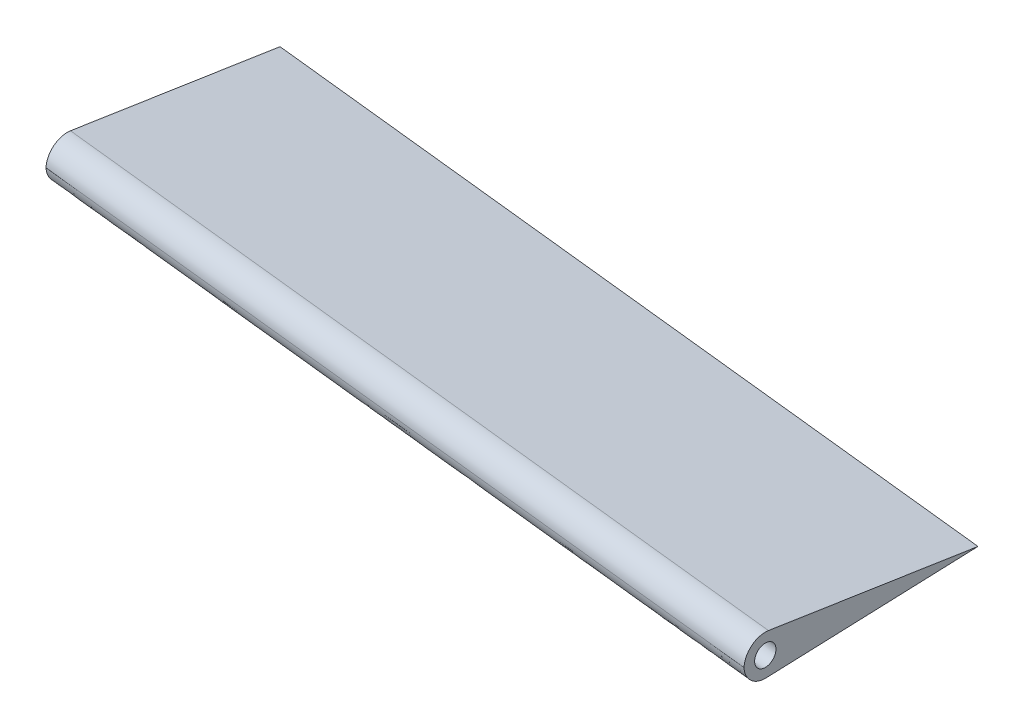
ISO-10303-21;
HEADER;
FILE_DESCRIPTION(('STEP AP214'),'2;1');
FILE_NAME('part.step','',(''),(''),'','','');
FILE_SCHEMA(('AUTOMOTIVE_DESIGN { 1 0 10303 214 1 1 1 1 }'));
ENDSEC;
DATA;
#1=APPLICATION_CONTEXT('core data for automotive mechanical design processes');
#2=APPLICATION_PROTOCOL_DEFINITION('international standard','automotive_design',2000,#1);
#3=PRODUCT_CONTEXT('',#1,'mechanical');
#4=PRODUCT('Part','Part','',(#3));
#5=PRODUCT_RELATED_PRODUCT_CATEGORY('part','',(#4));
#6=PRODUCT_DEFINITION_FORMATION('','',#4);
#7=PRODUCT_DEFINITION_CONTEXT('part definition',#1,'design');
#8=PRODUCT_DEFINITION('design','',#6,#7);
#9=PRODUCT_DEFINITION_SHAPE('','',#8);
#10=(LENGTH_UNIT() NAMED_UNIT(*) SI_UNIT(.MILLI.,.METRE.));
#11=(NAMED_UNIT(*) PLANE_ANGLE_UNIT() SI_UNIT($,.RADIAN.));
#12=(NAMED_UNIT(*) SI_UNIT($,.STERADIAN.) SOLID_ANGLE_UNIT());
#13=UNCERTAINTY_MEASURE_WITH_UNIT(LENGTH_MEASURE(1.E-05),#10,'distance_accuracy_value','');
#14=(GEOMETRIC_REPRESENTATION_CONTEXT(3) GLOBAL_UNCERTAINTY_ASSIGNED_CONTEXT((#13)) GLOBAL_UNIT_ASSIGNED_CONTEXT((#10,
#11,#12)) REPRESENTATION_CONTEXT('',''));
#15=CARTESIAN_POINT('',(0.,0.,0.));
#16=DIRECTION('',(0.,0.,1.));
#17=DIRECTION('',(1.,0.,0.));
#18=AXIS2_PLACEMENT_3D('',#15,#16,#17);
#19=CARTESIAN_POINT('',(0.,0.,0.));
#20=DIRECTION('',(1.,0.,0.));
#21=DIRECTION('',(0.,0.,-1.));
#22=AXIS2_PLACEMENT_3D('',#19,#20,#21);
#23=PLANE('',#22);
#24=CARTESIAN_POINT('',(0.,-0.3146960033909,22.5890369420885));
#25=DIRECTION('',(1.,0.,0.));
#26=DIRECTION('',(0.,0.,1.));
#27=AXIS2_PLACEMENT_3D('',#24,#25,#26);
#28=ELLIPSE('',#27,2.51432968015768,2.5);
#29=CARTESIAN_POINT('',(0.,-0.3146960033909,25.1033666222462));
#30=VERTEX_POINT('',#29);
#31=EDGE_CURVE('E136',#30,#30,#28,.T.);
#32=ORIENTED_EDGE('',*,*,#31,.T.);
#33=EDGE_LOOP('',(#32));
#34=FACE_BOUND('',#33,.T.);
#35=DIRECTION('',(0.,0.0373019729604991,-0.999304039225928));
#36=VECTOR('',#35,1.);
#37=CARTESIAN_POINT('',(0.,-3.17592912009792,-27.625));
#38=LINE('',#37,#36);
#39=CARTESIAN_POINT('',(0.,-5.04354721919535,22.4076969872574));
#40=VERTEX_POINT('',#39);
#41=CARTESIAN_POINT('',(0.,-3.17592912009792,-27.625));
#42=VERTEX_POINT('',#41);
#43=EDGE_CURVE('E123',#40,#42,#38,.T.);
#44=ORIENTED_EDGE('',*,*,#43,.F.);
#45=CARTESIAN_POINT('',(202.232306720039,-0.0504525145305452,49.3087912444578));
#46=CARTESIAN_POINT('',(202.232221022979,-5.24202816377805,49.3087820558312));
#47=CARTESIAN_POINT('',(202.78531289137,-5.04692032005726,44.1504412330736));
#48=CARTESIAN_POINT('',(196.160536840523,-0.0503511357956261,48.6577627679144));
#49=CARTESIAN_POINT('',(196.160438314185,-5.24191621252106,48.6577522037044));
#50=CARTESIAN_POINT('',(196.71354192783,-5.04681932374674,43.4994228663843));
#51=CARTESIAN_POINT('',(190.088766961008,-0.0502497570607069,48.006734291371));
#52=CARTESIAN_POINT('',(190.08866843484,-5.24180426150062,48.0067237271793));
#53=CARTESIAN_POINT('',(190.64177096429,-5.04671832743621,42.8484044996949));
#54=CARTESIAN_POINT('',(184.016997081492,-0.0501483783257878,47.3557058148276));
#55=CARTESIAN_POINT('',(184.016911384903,-5.24169231071673,47.3556966262514));
#56=CARTESIAN_POINT('',(184.57000000075,-5.04661733112569,42.1973861330055));
#57=CARTESIAN_POINT('',(171.764231462868,-0.0499437973171223,46.0419374256389));
#58=CARTESIAN_POINT('',(171.764171888981,-5.24146639549514,46.041931037996));
#59=CARTESIAN_POINT('',(172.317232194576,-5.04641352154402,40.8836381454083));
#60=CARTESIAN_POINT('',(159.511465844245,-0.0497392161220963,44.7281690364501));
#61=CARTESIAN_POINT('',(159.511406270487,-5.24124047973213,44.7281626488213));
#62=CARTESIAN_POINT('',(160.0644643884,-5.04620971170966,39.569890157823));
#63=CARTESIAN_POINT('',(128.934164727482,-0.0492286746013664,41.4496037815293));
#64=CARTESIAN_POINT('',(128.934137458176,-5.24067669779517,41.4496008576546));
#65=CARTESIAN_POINT('',(129.487157812505,-5.04570109491283,36.2913758160095));
#66=CARTESIAN_POINT('',(110.609629229342,-0.0489227140819818,39.4848069157972));
#67=CARTESIAN_POINT('',(110.609601959887,-5.24033883098845,39.4848039919064));
#68=CARTESIAN_POINT('',(111.162619042782,-5.04539628763793,34.3266094617974));
#69=CARTESIAN_POINT('',(73.9605582330638,-0.0483107925415967,35.5552131843329));
#70=CARTESIAN_POINT('',(73.9605309641831,-5.2396630974396,35.5552102605038));
#71=CARTESIAN_POINT('',(74.5135415033312,-5.04478667195823,30.397076753439));
#72=CARTESIAN_POINT('',(55.6360227349244,-0.0480048315205963,33.5904163186008));
#73=CARTESIAN_POINT('',(55.6359954658938,-5.23932523069746,33.5904133947556));
#74=CARTESIAN_POINT('',(56.189002733602,-5.04448186355343,28.4323103992926));
#75=CARTESIAN_POINT('',(24.6900015031474,-0.0474881315512742,30.2723160846686));
#76=CARTESIAN_POINT('',(24.6899435276472,-5.23875464904923,30.2723098684084));
#77=CARTESIAN_POINT('',(25.24297597684,-5.04396710972218,25.1142616926196));
#78=CARTESIAN_POINT('',(12.0685157695098,-0.0472773927843041,28.9190127164685));
#79=CARTESIAN_POINT('',(12.0684577941321,-5.23852193474188,28.9190065002214));
#80=CARTESIAN_POINT('',(12.6214879898087,-5.04375716459272,23.7609793400775));
#81=CARTESIAN_POINT('',(-0.552969964127832,-0.047066653822848,27.5657093482685));
#82=CARTESIAN_POINT('',(-0.553055655944351,-5.23828921986331,27.565700160204));
#83=CARTESIAN_POINT('',(2.776070567867E-09,-5.04354721919514,22.4076969875481));
#84=CARTESIAN_POINT('',(-6.25601972862951,-0.0469714309814772,26.9542158507364));
#85=CARTESIAN_POINT('',(-6.25611673815051,-5.2381840671987,26.9542054491629));
#86=CARTESIAN_POINT('',(-5.70305077992851,-5.04345235478978,21.7962129860065));
#87=CARTESIAN_POINT('',(-11.9590694931312,-0.0468762081401064,26.3427223532044));
#88=CARTESIAN_POINT('',(-11.9591665024935,-5.23807891474277,26.3427119516479));
#89=CARTESIAN_POINT('',(-11.4061015626331,-5.04335749038441,21.1847289844648));
#90=CARTESIAN_POINT('',(-17.6621192576329,-0.0467809852987356,25.7312288556723));
#91=CARTESIAN_POINT('',(-17.662204949007,-5.23797376249552,25.7312196676554));
#92=CARTESIAN_POINT('',(-17.1091523453377,-5.04326262597904,20.5732449829231));
#93=(BOUNDED_SURFACE() B_SPLINE_SURFACE(3,2,((#45,#46,#47),(#48,#49,#50),(#51,#52,#53),(#54,#55,
#56),(#57,#58,#59),(#60,#61,#62),(#63,#64,#65),(#66,#67,#68),(#69,#70,#71),(#72,#73,#74),(#75,
#76,#77),(#78,#79,#80),(#81,#82,#83),(#84,#85,#86),(#87,#88,#89),(#90,#91,#92)),.UNSPECIFIED.,
.F.,.F.,.F.) B_SPLINE_SURFACE_WITH_KNOTS((4,3,2,2,2,3,4),(3,3),(0.,18.3197174655093,
55.288708181309,110.577416362618,165.866124543927,203.947615974501,221.154832725236),(0.,1.),
.UNSPECIFIED.) GEOMETRIC_REPRESENTATION_ITEM() RATIONAL_B_SPLINE_SURFACE(((1.,0.69369243042474,
1.),(1.,0.693693163299334,1.),(1.,0.693693896173927,1.),(1.,0.69369462904852,1.),(1.,
0.69369610797965,1.),(1.,0.693697586907078,1.),(1.,0.693701277624546,1.),(1.,0.693703489410007,
1.),(1.,0.693707912964367,1.),(1.,0.693710124733266,1.),(1.,0.693713859899759,1.),(1.,
0.693715383301706,1.),(1.,0.693716906699723,1.),(1.,0.69371759505011,1.),(1.,0.693718283400498,
1.),(1.,0.693718971750885,1.))) REPRESENTATION_ITEM('') SURFACE());
#94=CARTESIAN_POINT('',(0.,-5.04354721919536,22.4076969872574));
#95=CARTESIAN_POINT('',(0.,-5.04886143666536,22.5496684300286));
#96=CARTESIAN_POINT('',(0.,-5.04816441329013,22.6918622555522));
#97=CARTESIAN_POINT('',(0.,-5.03481755780054,22.9756826366904));
#98=CARTESIAN_POINT('',(0.,-5.02216818687273,23.1173092139808));
#99=CARTESIAN_POINT('',(0.,-4.98499826395163,23.3989066313298));
#100=CARTESIAN_POINT('',(0.,-4.96048509556508,23.5388784458215));
#101=CARTESIAN_POINT('',(0.,-4.89976392910195,23.8162600406056));
#102=CARTESIAN_POINT('',(0.,-4.86355609283761,23.953669856319));
#103=CARTESIAN_POINT('',(0.,-4.77967842915773,24.2249986382987));
#104=CARTESIAN_POINT('',(0.,-4.73200458812256,24.3589163639406));
#105=CARTESIAN_POINT('',(0.,-4.62551123074078,24.6223024158476));
#106=CARTESIAN_POINT('',(0.,-4.56668760006863,24.7517690787494));
#107=CARTESIAN_POINT('',(0.,-4.43835008042149,25.0051999164264));
#108=CARTESIAN_POINT('',(0.,-4.36884220011645,25.1291671338263));
#109=CARTESIAN_POINT('',(0.,-4.21956850101304,25.3708273170201));
#110=CARTESIAN_POINT('',(0.,-4.13979892131772,25.488517959977));
#111=CARTESIAN_POINT('',(0.,-3.97080777511161,25.7164159879842));
#112=CARTESIAN_POINT('',(0.,-3.88161214223755,25.8266426032374));
#113=CARTESIAN_POINT('',(0.,-3.69418344278608,26.0391978270292));
#114=CARTESIAN_POINT('',(0.,-3.59594702980572,26.1415234850837));
#115=CARTESIAN_POINT('',(0.,-3.39118315697175,26.3374600416571));
#116=CARTESIAN_POINT('',(0.,-3.28465775489765,26.4310730905283));
#117=CARTESIAN_POINT('',(0.,-3.06400998742726,26.6089583959605));
#118=CARTESIAN_POINT('',(0.,-2.94988489712824,26.693227272948));
#119=CARTESIAN_POINT('',(0.,-2.71554094857014,26.8513213230926));
#120=CARTESIAN_POINT('',(0.,-2.59535955572514,26.9252020305408));
#121=CARTESIAN_POINT('',(0.,-2.3491292692167,27.0625575371984));
#122=CARTESIAN_POINT('',(0.,-2.22307806321206,27.1260281902004));
#123=CARTESIAN_POINT('',(0.,-1.96613625560766,27.2420177715663));
#124=CARTESIAN_POINT('',(0.,-1.83524925177856,27.2945446561947));
#125=CARTESIAN_POINT('',(0.,-1.56949120121452,27.3883238207112));
#126=CARTESIAN_POINT('',(0.,-1.43461921923321,27.4295734302349));
#127=CARTESIAN_POINT('',(0.,-1.09411516332076,27.5180659964922));
#128=CARTESIAN_POINT('',(0.,-0.886551295440261,27.5581421544381));
#129=CARTESIAN_POINT('',(0.,-0.572923335898072,27.5982383351619));
#130=CARTESIAN_POINT('',(0.,-0.468028136661163,27.6082673780364));
#131=CARTESIAN_POINT('',(0.,-0.257792656460519,27.6216479246561));
#132=CARTESIAN_POINT('',(0.,-0.152452294877932,27.6249981619441));
#133=CARTESIAN_POINT('',(0.,-0.0470758868524576,27.625));
#134=B_SPLINE_CURVE_WITH_KNOTS('',3,(#94,#95,#96,#97,#98,#99,#100,#101,#102,#103,#104,#105,#106,
#107,#108,#109,#110,#111,#112,#113,#114,#115,#116,#117,#118,#119,#120,#121,#122,#123,#124,#125,
#126,#127,#128,#129,#130,#131,#132,#133),.UNSPECIFIED.,.F.,.F.,(4,2,2,2,2,2,2,2,2,2,2,2,2,2,2,2,
2,2,2,4),(0.,0.426083158874941,0.852149877816592,1.27795176827229,1.7037477674098,
2.12969303186866,2.55579577923112,2.98165976334294,3.40768027299791,3.83255778102335,
4.25759319291565,4.68252342241649,5.10760684161099,5.53032356158867,5.95320823815481,
6.37578439081045,6.79846051947073,7.43068032547166,7.74662452421628,8.0626286276542),.UNSPECIFIED.);
#135=CARTESIAN_POINT('',(0.,-0.316460330774592,27.6176963024039));
#136=VERTEX_POINT('',#135);
#137=EDGE_CURVE('E283',#40,#136,#134,.T.);
#138=ORIENTED_EDGE('',*,*,#137,.T.);
#139=CARTESIAN_POINT('',(0.,-0.585844787586447,22.5963406396846));
#140=DIRECTION('',(1.,0.,0.));
#141=DIRECTION('',(0.,0.,-1.));
#142=AXIS2_PLACEMENT_3D('',#139,#140,#141);
#143=ELLIPSE('',#142,5.02865936031537,5.);
#144=CARTESIAN_POINT('',(0.,4.35651734296019,21.8349965835324));
#145=VERTEX_POINT('',#144);
#146=EDGE_CURVE('E211',#136,#145,#143,.F.);
#147=ORIENTED_EDGE('',*,*,#146,.T.);
#148=DIRECTION('',(0.,0.150557748633231,0.988601216025194));
#149=VECTOR('',#148,1.);
#150=CARTESIAN_POINT('',(0.,5.23829845432376,27.625));
#151=LINE('',#150,#149);
#152=EDGE_CURVE('E126',#42,#145,#151,.T.);
#153=ORIENTED_EDGE('',*,*,#152,.F.);
#154=EDGE_LOOP('',(#44,#138,#147,#153));
#155=FACE_BOUND('',#154,.T.);
#156=ADVANCED_FACE('F55',(#34,#155),#23,.F.);
#157=CARTESIAN_POINT('',(184.57,0.,0.));
#158=DIRECTION('',(1.,0.,0.));
#159=DIRECTION('',(0.,0.,-1.));
#160=AXIS2_PLACEMENT_3D('',#157,#158,#159);
#161=PLANE('',#160);
#162=CARTESIAN_POINT('',(184.57,-0.314696003390896,42.3790369420885));
#163=DIRECTION('',(1.,0.,0.));
#164=DIRECTION('',(0.,0.,1.));
#165=AXIS2_PLACEMENT_3D('',#162,#163,#164);
#166=ELLIPSE('',#165,2.51432968015768,2.5);
#167=CARTESIAN_POINT('',(184.57,-0.314696003390895,44.8933666222462));
#168=VERTEX_POINT('',#167);
#169=EDGE_CURVE('E59',#168,#168,#166,.T.);
#170=ORIENTED_EDGE('',*,*,#169,.F.);
#171=EDGE_LOOP('',(#170));
#172=FACE_BOUND('',#171,.T.);
#173=CARTESIAN_POINT('',(184.57,-0.585844787586442,42.3863406396846));
#174=DIRECTION('',(1.,0.,0.));
#175=DIRECTION('',(0.,0.,-1.));
#176=AXIS2_PLACEMENT_3D('',#173,#174,#175);
#177=ELLIPSE('',#176,5.02865936031537,5.);
#178=CARTESIAN_POINT('',(184.57,4.35651734296019,41.6249965835324));
#179=VERTEX_POINT('',#178);
#180=CARTESIAN_POINT('',(184.57,-0.318001193320483,47.4077796767494));
#181=VERTEX_POINT('',#180);
#182=EDGE_CURVE('E73',#179,#181,#177,.T.);
#183=ORIENTED_EDGE('',*,*,#182,.T.);
#184=CARTESIAN_POINT('',(184.57,-0.0501576118543741,47.415));
#185=CARTESIAN_POINT('',(184.57,-0.190206610321247,47.4150156253586));
#186=CARTESIAN_POINT('',(184.57,-0.330253144891013,47.4090828174751));
#187=CARTESIAN_POINT('',(184.57,-0.60933971248626,47.3854333610584));
#188=CARTESIAN_POINT('',(184.57,-0.748379804777932,47.3677174121982));
#189=CARTESIAN_POINT('',(184.57,-1.02434014849959,47.3206366203252));
#190=CARTESIAN_POINT('',(184.57,-1.16126225450392,47.2912826473118));
#191=CARTESIAN_POINT('',(184.57,-1.43214570747578,47.2211464918777));
#192=CARTESIAN_POINT('',(184.57,-1.56610708413539,47.1803644241213));
#193=CARTESIAN_POINT('',(184.57,-1.83015326053831,47.0876582660807));
#194=CARTESIAN_POINT('',(184.57,-1.96023712152669,47.0357315021966));
#195=CARTESIAN_POINT('',(184.57,-2.21562347466463,46.9211001309626));
#196=CARTESIAN_POINT('',(184.57,-2.34092418276253,46.8583915492238));
#197=CARTESIAN_POINT('',(184.57,-2.58575261952758,46.7226989571516));
#198=CARTESIAN_POINT('',(184.57,-2.70528311177856,46.649719932647));
#199=CARTESIAN_POINT('',(184.57,-2.93784298914223,46.4939628889014));
#200=CARTESIAN_POINT('',(184.57,-3.05086995257709,46.4111812541647));
#201=CARTESIAN_POINT('',(184.57,-3.26982399293588,46.2362483215728));
#202=CARTESIAN_POINT('',(184.57,-3.3757352392962,46.1440772101092));
#203=CARTESIAN_POINT('',(184.57,-3.57949155375795,45.9511416829634));
#204=CARTESIAN_POINT('',(184.57,-3.67733362337886,45.8503741009051));
#205=CARTESIAN_POINT('',(184.57,-3.86420919292867,45.6410209458274));
#206=CARTESIAN_POINT('',(184.57,-3.95324475980342,45.532437217697));
#207=CARTESIAN_POINT('',(184.57,-4.12195218173115,45.3081628462163));
#208=CARTESIAN_POINT('',(184.57,-4.20162060661918,45.1924696228993));
#209=CARTESIAN_POINT('',(184.57,-4.35139293025366,44.9542231600436));
#210=CARTESIAN_POINT('',(184.57,-4.42144592010894,44.8316379120627));
#211=CARTESIAN_POINT('',(184.57,-4.55104735758599,44.5809769181086));
#212=CARTESIAN_POINT('',(184.57,-4.61059168023337,44.4528990405213));
#213=CARTESIAN_POINT('',(184.57,-4.71870344454291,44.192271542647));
#214=CARTESIAN_POINT('',(184.57,-4.76727733341533,44.0597246017023));
#215=CARTESIAN_POINT('',(184.57,-4.85317113860267,43.7910265965483));
#216=CARTESIAN_POINT('',(184.57,-4.89048804600307,43.6548745792865));
#217=CARTESIAN_POINT('',(184.57,-4.97162389586605,43.3012895946864));
#218=CARTESIAN_POINT('',(184.57,-5.00699233485915,43.0818287914544));
#219=CARTESIAN_POINT('',(184.57,-5.03821438840134,42.750881548815));
#220=CARTESIAN_POINT('',(184.57,-5.0449842269391,42.6402979636791));
#221=CARTESIAN_POINT('',(184.57,-5.05125475045205,42.4189067720719));
#222=CARTESIAN_POINT('',(184.57,-5.05075425279813,42.3080991320858));
#223=CARTESIAN_POINT('',(184.57,-5.04661733112594,42.1973861329322));
#224=B_SPLINE_CURVE_WITH_KNOTS('',3,(#184,#185,#186,#187,#188,#189,#190,#191,#192,#193,#194,
#195,#196,#197,#198,#199,#200,#201,#202,#203,#204,#205,#206,#207,#208,#209,#210,#211,#212,#213,
#214,#215,#216,#217,#218,#219,#220,#221,#222,#223),.UNSPECIFIED.,.F.,.F.,(4,2,2,2,2,2,2,2,2,2,2,
2,2,2,2,2,2,2,2,4),(0.,0.420017858393631,0.84001077870151,1.25961234320772,1.67920969777229,
2.09890782600457,2.51876099616762,2.93841104548446,3.35821635923495,3.77892665267648,
4.19979258285711,4.62055949737894,5.04148001629581,5.46454956744895,5.88778481880003,
6.31077068817557,6.73386951881763,7.39851470666061,7.73068930517586,8.06291793747157),.UNSPECIFIED.);
#225=CARTESIAN_POINT('',(184.57,-5.04661733112595,42.1973861329322));
#226=VERTEX_POINT('',#225);
#227=EDGE_CURVE('E65',#181,#226,#224,.T.);
#228=ORIENTED_EDGE('',*,*,#227,.T.);
#229=DIRECTION('',(0.,0.0373634386499088,-0.99930174294467));
#230=VECTOR('',#229,1.);
#231=CARTESIAN_POINT('',(184.57,-3.17592912009791,-7.835));
#232=LINE('',#231,#230);
#233=CARTESIAN_POINT('',(184.57,-3.17592912009791,-7.835));
#234=VERTEX_POINT('',#233);
#235=EDGE_CURVE('E97',#226,#234,#232,.T.);
#236=ORIENTED_EDGE('',*,*,#235,.T.);
#237=DIRECTION('',(0.,0.150557748633231,0.988601216025194));
#238=VECTOR('',#237,1.);
#239=CARTESIAN_POINT('',(184.57,5.23829845432376,47.415));
#240=LINE('',#239,#238);
#241=EDGE_CURVE('E100',#234,#179,#240,.T.);
#242=ORIENTED_EDGE('',*,*,#241,.T.);
#243=EDGE_LOOP('',(#183,#228,#236,#242));
#244=FACE_BOUND('',#243,.T.);
#245=ADVANCED_FACE('F99',(#172,#244),#161,.T.);
#246=CARTESIAN_POINT('',(0.0164525120782077,1.00754758115582,-0.153443160903224));
#247=DIRECTION('',(0.0161410288046972,0.988472426109326,-0.150538134738907));
#248=DIRECTION('',(0.,0.150557748633231,0.988601216025194));
#249=AXIS2_PLACEMENT_3D('',#246,#247,#248);
#250=PLANE('',#249);
#251=ORIENTED_EDGE('',*,*,#152,.T.);
#252=DIRECTION('',(-0.994300795050557,0.,-0.106611110874197));
#253=VECTOR('',#252,1.);
#254=CARTESIAN_POINT('',(-2.31458632898798,4.35651734296018,21.5868215634821));
#255=LINE('',#254,#253);
#256=EDGE_CURVE('E12',#145,#179,#255,.F.);
#257=ORIENTED_EDGE('',*,*,#256,.T.);
#258=ORIENTED_EDGE('',*,*,#241,.F.);
#259=DIRECTION('',(-0.994300795050557,0.,-0.106611110874197));
#260=VECTOR('',#259,1.);
#261=CARTESIAN_POINT('',(184.57,-3.17592912009791,-7.835));
#262=LINE('',#261,#260);
#263=EDGE_CURVE('E109',#234,#42,#262,.T.);
#264=ORIENTED_EDGE('',*,*,#263,.T.);
#265=EDGE_LOOP('',(#251,#257,#258,#264));
#266=FACE_BOUND('',#265,.T.);
#267=ADVANCED_FACE('F114',(#266),#250,.T.);
#268=CARTESIAN_POINT('',(184.57,-3.17592912009791,-7.835));
#269=CARTESIAN_POINT('',(0.,-3.17592912009792,-27.625));
#270=CARTESIAN_POINT('',(184.57,-3.52022452436097,1.37333333333339));
#271=CARTESIAN_POINT('',(0.,-3.51965734246889,-18.4166666666667));
#272=CARTESIAN_POINT('',(184.57,-3.86451992862403,10.5816666666667));
#273=CARTESIAN_POINT('',(0.,-3.86338556483986,-9.20833333333338));
#274=CARTESIAN_POINT('',(184.57,-4.55311073715013,28.9983333333334));
#275=CARTESIAN_POINT('',(0.,-4.55084200958181,9.20833333333328));
#276=CARTESIAN_POINT('',(184.57,-4.89740614141319,38.2066666666667));
#277=CARTESIAN_POINT('',(0.,-4.89457023195279,18.4166666666666));
#278=CARTESIAN_POINT('',(184.57,-5.24170154567624,47.415));
#279=CARTESIAN_POINT('',(0.,-5.23829845432376,27.625));
#280=B_SPLINE_SURFACE_WITH_KNOTS('',3,1,((#268,#269),(#270,#271),(#272,#273),(#274,#275),(#276,
#277),(#278,#279)),.UNSPECIFIED.,.F.,.F.,.F.,(4,2,4),(2,2),(0.,0.5,1.),(0.,1.),.UNSPECIFIED.);
#281=CARTESIAN_POINT('',(202.78531289137,-5.04692032005726,44.1504412330736));
#282=CARTESIAN_POINT('',(196.71354192783,-5.04681932374674,43.4994228663843));
#283=CARTESIAN_POINT('',(190.64177096429,-5.04671832743621,42.8484044996949));
#284=CARTESIAN_POINT('',(184.57000000075,-5.04661733112569,42.1973861330055));
#285=CARTESIAN_POINT('',(172.317232194576,-5.04641352154402,40.8836381454083));
#286=CARTESIAN_POINT('',(160.0644643884,-5.04620971170966,39.569890157823));
#287=CARTESIAN_POINT('',(129.487157812505,-5.04570109491283,36.2913758160095));
#288=CARTESIAN_POINT('',(111.162619042782,-5.04539628763793,34.3266094617974));
#289=CARTESIAN_POINT('',(74.5135415033312,-5.04478667195823,30.397076753439));
#290=CARTESIAN_POINT('',(56.189002733602,-5.04448186355343,28.4323103992926));
#291=CARTESIAN_POINT('',(25.2429759768399,-5.04396710972218,25.1142616926196));
#292=CARTESIAN_POINT('',(12.6214879898087,-5.04375716459272,23.7609793400775));
#293=CARTESIAN_POINT('',(2.776070567867E-09,-5.04354721919514,22.4076969875481));
#294=CARTESIAN_POINT('',(-5.70305077992851,-5.04345235478978,21.7962129860065));
#295=CARTESIAN_POINT('',(-11.4061015626331,-5.04335749038441,21.1847289844648));
#296=CARTESIAN_POINT('',(-17.1091523453377,-5.04326262597904,20.5732449829231));
#297=B_SPLINE_CURVE_WITH_KNOTS('',3,(#281,#282,#283,#284,#285,#286,#287,#288,#289,#290,#291,
#292,#293,#294,#295,#296),.UNSPECIFIED.,.F.,.F.,(4,3,2,2,2,3,4),(0.,18.3197174655093,
55.288708181309,110.577416362618,165.866124543927,203.947615974501,221.154832725236),.UNSPECIFIED.);
#298=EDGE_CURVE('E190',#226,#40,#297,.T.);
#299=ORIENTED_EDGE('',*,*,#235,.F.);
#300=ORIENTED_EDGE('',*,*,#298,.T.);
#301=ORIENTED_EDGE('',*,*,#43,.T.);
#302=ORIENTED_EDGE('',*,*,#263,.F.);
#303=EDGE_LOOP('',(#299,#300,#301,#302));
#304=FACE_BOUND('',#303,.T.);
#305=ADVANCED_FACE('F121',(#304),#280,.T.);
#306=CARTESIAN_POINT('',(-2.39529147301146,-0.585844787586447,22.3395122371766));
#307=DIRECTION('',(-0.994300795050557,0.,-0.106611110874197));
#308=DIRECTION('',(-0.106611110874197,0.,0.994300795050557));
#309=AXIS2_PLACEMENT_3D('',#306,#307,#308);
#310=CYLINDRICAL_SURFACE('',#309,5.);
#311=CARTESIAN_POINT('',(202.232306720039,-0.0504525145305452,49.3087912444578));
#312=CARTESIAN_POINT('',(202.232221022979,-5.24202816377805,49.3087820558312));
#313=CARTESIAN_POINT('',(202.78531289137,-5.04692032005726,44.1504412330736));
#314=CARTESIAN_POINT('',(196.160536840523,-0.0503511357956261,48.6577627679144));
#315=CARTESIAN_POINT('',(196.160438314185,-5.24191621252106,48.6577522037044));
#316=CARTESIAN_POINT('',(196.71354192783,-5.04681932374674,43.4994228663843));
#317=CARTESIAN_POINT('',(190.088766961008,-0.0502497570607069,48.006734291371));
#318=CARTESIAN_POINT('',(190.08866843484,-5.24180426150062,48.0067237271793));
#319=CARTESIAN_POINT('',(190.64177096429,-5.04671832743621,42.8484044996949));
#320=CARTESIAN_POINT('',(184.016997081492,-0.0501483783257878,47.3557058148276));
#321=CARTESIAN_POINT('',(184.016911384903,-5.24169231071673,47.3556966262514));
#322=CARTESIAN_POINT('',(184.57000000075,-5.04661733112569,42.1973861330055));
#323=CARTESIAN_POINT('',(171.764231462868,-0.0499437973171223,46.0419374256389));
#324=CARTESIAN_POINT('',(171.764171888981,-5.24146639549514,46.041931037996));
#325=CARTESIAN_POINT('',(172.317232194576,-5.04641352154402,40.8836381454083));
#326=CARTESIAN_POINT('',(159.511465844245,-0.0497392161220963,44.7281690364501));
#327=CARTESIAN_POINT('',(159.511406270487,-5.24124047973213,44.7281626488213));
#328=CARTESIAN_POINT('',(160.0644643884,-5.04620971170966,39.569890157823));
#329=CARTESIAN_POINT('',(128.934164727482,-0.0492286746013664,41.4496037815293));
#330=CARTESIAN_POINT('',(128.934137458176,-5.24067669779517,41.4496008576546));
#331=CARTESIAN_POINT('',(129.487157812505,-5.04570109491283,36.2913758160095));
#332=CARTESIAN_POINT('',(110.609629229342,-0.0489227140819818,39.4848069157972));
#333=CARTESIAN_POINT('',(110.609601959887,-5.24033883098845,39.4848039919064));
#334=CARTESIAN_POINT('',(111.162619042782,-5.04539628763793,34.3266094617974));
#335=CARTESIAN_POINT('',(73.9605582330638,-0.0483107925415967,35.5552131843329));
#336=CARTESIAN_POINT('',(73.9605309641831,-5.2396630974396,35.5552102605038));
#337=CARTESIAN_POINT('',(74.5135415033312,-5.04478667195823,30.397076753439));
#338=CARTESIAN_POINT('',(55.6360227349244,-0.0480048315205963,33.5904163186008));
#339=CARTESIAN_POINT('',(55.6359954658938,-5.23932523069746,33.5904133947556));
#340=CARTESIAN_POINT('',(56.189002733602,-5.04448186355343,28.4323103992926));
#341=CARTESIAN_POINT('',(24.6900015031474,-0.0474881315512742,30.2723160846686));
#342=CARTESIAN_POINT('',(24.6899435276472,-5.23875464904923,30.2723098684084));
#343=CARTESIAN_POINT('',(25.24297597684,-5.04396710972218,25.1142616926196));
#344=CARTESIAN_POINT('',(12.0685157695098,-0.0472773927843041,28.9190127164685));
#345=CARTESIAN_POINT('',(12.0684577941321,-5.23852193474188,28.9190065002214));
#346=CARTESIAN_POINT('',(12.6214879898087,-5.04375716459272,23.7609793400775));
#347=CARTESIAN_POINT('',(-0.552969964127832,-0.047066653822848,27.5657093482685));
#348=CARTESIAN_POINT('',(-0.553055655944351,-5.23828921986331,27.565700160204));
#349=CARTESIAN_POINT('',(2.776070567867E-09,-5.04354721919514,22.4076969875481));
#350=CARTESIAN_POINT('',(-6.25601972862951,-0.0469714309814772,26.9542158507364));
#351=CARTESIAN_POINT('',(-6.25611673815051,-5.2381840671987,26.9542054491629));
#352=CARTESIAN_POINT('',(-5.70305077992851,-5.04345235478978,21.7962129860065));
#353=CARTESIAN_POINT('',(-11.9590694931312,-0.0468762081401064,26.3427223532044));
#354=CARTESIAN_POINT('',(-11.9591665024935,-5.23807891474277,26.3427119516479));
#355=CARTESIAN_POINT('',(-11.4061015626331,-5.04335749038441,21.1847289844648));
#356=CARTESIAN_POINT('',(-17.6621192576329,-0.0467809852987356,25.7312288556723));
#357=CARTESIAN_POINT('',(-17.662204949007,-5.23797376249552,25.7312196676554));
#358=CARTESIAN_POINT('',(-17.1091523453377,-5.04326262597904,20.5732449829231));
#359=(BOUNDED_SURFACE() B_SPLINE_SURFACE(3,2,((#311,#312,#313),(#314,#315,#316),(#317,#318,
#319),(#320,#321,#322),(#323,#324,#325),(#326,#327,#328),(#329,#330,#331),(#332,#333,#334),
(#335,#336,#337),(#338,#339,#340),(#341,#342,#343),(#344,#345,#346),(#347,#348,#349),(#350,#351,
#352),(#353,#354,#355),(#356,#357,#358)),.UNSPECIFIED.,.F.,.F.,
.F.) B_SPLINE_SURFACE_WITH_KNOTS((4,3,2,2,2,3,4),(3,3),(0.,18.3197174655093,55.288708181309,
110.577416362618,165.866124543927,203.947615974501,221.154832725236),(0.,1.),
.UNSPECIFIED.) GEOMETRIC_REPRESENTATION_ITEM() RATIONAL_B_SPLINE_SURFACE(((1.,0.69369243042474,
1.),(1.,0.693693163299334,1.),(1.,0.693693896173927,1.),(1.,0.69369462904852,1.),(1.,
0.69369610797965,1.),(1.,0.693697586907078,1.),(1.,0.693701277624546,1.),(1.,0.693703489410007,
1.),(1.,0.693707912964367,1.),(1.,0.693710124733266,1.),(1.,0.693713859899759,1.),(1.,
0.693715383301706,1.),(1.,0.693716906699723,1.),(1.,0.69371759505011,1.),(1.,0.693718283400498,
1.),(1.,0.693718971750885,1.))) REPRESENTATION_ITEM('') SURFACE());
#360=CARTESIAN_POINT('',(184.5702,-0.318001195018808,47.4078011212764));
#361=CARTESIAN_POINT('',(181.25586417486,-0.317973525733558,47.0524292758282));
#362=CARTESIAN_POINT('',(177.941528349744,-0.317945856442623,46.6970574301503));
#363=CARTESIAN_POINT('',(161.369849224289,-0.317807509960255,44.9201982006125));
#364=CARTESIAN_POINT('',(148.112505924319,-0.317696832685744,43.4987108133079));
#365=CARTESIAN_POINT('',(89.9033750786337,-0.317210880680322,37.2573739430762));
#366=CARTESIAN_POINT('',(44.9515875370536,-0.316835605118198,32.4375244215839));
#367=CARTESIAN_POINT('',(-0.000199999999458266,-0.316460329013269,27.6176748578699));
#368=B_SPLINE_CURVE_WITH_KNOTS('',3,(#360,#361,#362,#363,#364,#365,#366,#367),.UNSPECIFIED.,.F.,
.F.,(4,2,2,4),(0.,10.,50.,185.628342814495),.UNSPECIFIED.);
#369=EDGE_CURVE('E117',#181,#136,#368,.T.);
#370=ORIENTED_EDGE('',*,*,#369,.F.);
#371=ORIENTED_EDGE('',*,*,#182,.F.);
#372=ORIENTED_EDGE('',*,*,#256,.F.);
#373=ORIENTED_EDGE('',*,*,#146,.F.);
#374=EDGE_LOOP('',(#370,#371,#372,#373));
#375=FACE_BOUND('',#374,.T.);
#376=ADVANCED_FACE('F148',(#375),#310,.T.);
#377=ORIENTED_EDGE('',*,*,#227,.F.);
#378=ORIENTED_EDGE('',*,*,#369,.T.);
#379=ORIENTED_EDGE('',*,*,#137,.F.);
#380=ORIENTED_EDGE('',*,*,#298,.F.);
#381=EDGE_LOOP('',(#377,#378,#379,#380));
#382=FACE_BOUND('',#381,.T.);
#383=ADVANCED_FACE('F168',(#382),#93,.T.);
#384=CARTESIAN_POINT('',(-5.32297374655431,-0.3146960033909,22.0182960283739));
#385=DIRECTION('',(0.994300795050557,0.,0.106611110874197));
#386=DIRECTION('',(0.106611110874197,0.,-0.994300795050557));
#387=AXIS2_PLACEMENT_3D('',#384,#385,#386);
#388=CYLINDRICAL_SURFACE('',#387,2.5);
#389=ORIENTED_EDGE('',*,*,#169,.T.);
#390=EDGE_LOOP('',(#389));
#391=FACE_BOUND('',#390,.T.);
#392=ORIENTED_EDGE('',*,*,#31,.F.);
#393=EDGE_LOOP('',(#392));
#394=FACE_BOUND('',#393,.T.);
#395=ADVANCED_FACE('F242',(#391,#394),#388,.F.);
#396=CLOSED_SHELL('',(#156,#245,#267,#305,#376,#383,#395));
#397=MANIFOLD_SOLID_BREP('B2',#396);
#398=ADVANCED_BREP_SHAPE_REPRESENTATION('',(#18,#397),#14);
#399=SHAPE_DEFINITION_REPRESENTATION(#9,#398);
ENDSEC;
END-ISO-10303-21;
